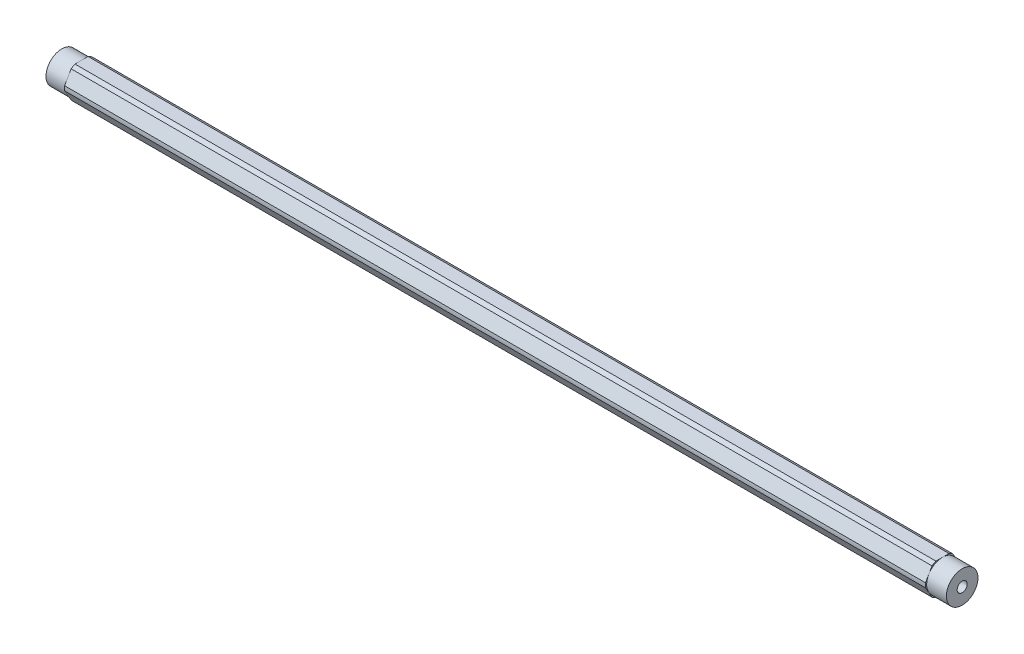
ISO-10303-21;
HEADER;
FILE_DESCRIPTION(('STEP AP214'),'2;1');
FILE_NAME('part.step','',(''),(''),'','','');
FILE_SCHEMA(('AUTOMOTIVE_DESIGN { 1 0 10303 214 1 1 1 1 }'));
ENDSEC;
DATA;
#1=APPLICATION_CONTEXT('core data for automotive mechanical design processes');
#2=APPLICATION_PROTOCOL_DEFINITION('international standard','automotive_design',2000,#1);
#3=PRODUCT_CONTEXT('',#1,'mechanical');
#4=PRODUCT('Part','Part','',(#3));
#5=PRODUCT_RELATED_PRODUCT_CATEGORY('part','',(#4));
#6=PRODUCT_DEFINITION_FORMATION('','',#4);
#7=PRODUCT_DEFINITION_CONTEXT('part definition',#1,'design');
#8=PRODUCT_DEFINITION('design','',#6,#7);
#9=PRODUCT_DEFINITION_SHAPE('','',#8);
#10=(LENGTH_UNIT() NAMED_UNIT(*) SI_UNIT(.MILLI.,.METRE.));
#11=(NAMED_UNIT(*) PLANE_ANGLE_UNIT() SI_UNIT($,.RADIAN.));
#12=(NAMED_UNIT(*) SI_UNIT($,.STERADIAN.) SOLID_ANGLE_UNIT());
#13=UNCERTAINTY_MEASURE_WITH_UNIT(LENGTH_MEASURE(1.E-05),#10,'distance_accuracy_value','');
#14=(GEOMETRIC_REPRESENTATION_CONTEXT(3) GLOBAL_UNCERTAINTY_ASSIGNED_CONTEXT((#13)) GLOBAL_UNIT_ASSIGNED_CONTEXT((#10,
#11,#12)) REPRESENTATION_CONTEXT('',''));
#15=CARTESIAN_POINT('',(0.,0.,0.));
#16=DIRECTION('',(0.,0.,1.));
#17=DIRECTION('',(1.,0.,0.));
#18=AXIS2_PLACEMENT_3D('',#15,#16,#17);
#19=CARTESIAN_POINT('',(-180.9496,0.,0.));
#20=DIRECTION('',(1.,0.,0.));
#21=DIRECTION('',(0.,0.,-1.));
#22=AXIS2_PLACEMENT_3D('',#19,#20,#21);
#23=PLANE('',#22);
#24=CARTESIAN_POINT('',(-180.9496,0.,0.));
#25=DIRECTION('',(1.,0.,0.));
#26=DIRECTION('',(0.,0.,-1.));
#27=AXIS2_PLACEMENT_3D('',#24,#25,#26);
#28=CIRCLE('',#27,2.0193);
#29=CARTESIAN_POINT('',(-180.9496,0.,-2.0193));
#30=VERTEX_POINT('',#29);
#31=EDGE_CURVE('E263',#30,#30,#28,.T.);
#32=ORIENTED_EDGE('',*,*,#31,.T.);
#33=EDGE_LOOP('',(#32));
#34=FACE_BOUND('',#33,.T.);
#35=CARTESIAN_POINT('',(-180.9496,0.,0.));
#36=DIRECTION('',(1.,0.,0.));
#37=DIRECTION('',(0.,0.,-1.));
#38=AXIS2_PLACEMENT_3D('',#35,#36,#37);
#39=CIRCLE('',#38,6.35);
#40=CARTESIAN_POINT('',(-180.9496,0.,-6.35));
#41=VERTEX_POINT('',#40);
#42=EDGE_CURVE('E73',#41,#41,#39,.F.);
#43=ORIENTED_EDGE('',*,*,#42,.T.);
#44=EDGE_LOOP('',(#43));
#45=FACE_BOUND('',#44,.T.);
#46=ADVANCED_FACE('F65',(#34,#45),#23,.F.);
#47=CARTESIAN_POINT('',(180.9496,3.175,-5.49926131403119));
#48=DIRECTION('',(0.,-0.5,0.866025403784438));
#49=DIRECTION('',(0.,-0.866025403784438,-0.5));
#50=AXIS2_PLACEMENT_3D('',#47,#48,#49);
#51=PLANE('',#50);
#52=DIRECTION('',(-1.,0.,0.));
#53=VECTOR('',#52,1.);
#54=CARTESIAN_POINT('',(180.9496,0.893039571032185,-6.81675178197583));
#55=LINE('',#54,#53);
#56=CARTESIAN_POINT('',(173.0121,0.893039571032185,-6.81675178197583));
#57=VERTEX_POINT('',#56);
#58=CARTESIAN_POINT('',(-173.0121,0.893039571032185,-6.81675178197583));
#59=VERTEX_POINT('',#58);
#60=EDGE_CURVE('E222',#57,#59,#55,.T.);
#61=ORIENTED_EDGE('',*,*,#60,.T.);
#62=DIRECTION('',(0.,0.866025403784438,0.5));
#63=VECTOR('',#62,1.);
#64=CARTESIAN_POINT('',(-173.0121,3.175,-5.49926131403119));
#65=LINE('',#64,#63);
#66=CARTESIAN_POINT('',(-173.0121,3.175,-5.49926131403119));
#67=VERTEX_POINT('',#66);
#68=EDGE_CURVE('E80',#59,#67,#65,.T.);
#69=ORIENTED_EDGE('',*,*,#68,.T.);
#70=CARTESIAN_POINT('',(-173.0121,5.45696042896782,-4.18177084608654));
#71=VERTEX_POINT('',#70);
#72=EDGE_CURVE('E191',#67,#71,#65,.T.);
#73=ORIENTED_EDGE('',*,*,#72,.T.);
#74=DIRECTION('',(-1.,0.,0.));
#75=VECTOR('',#74,1.);
#76=CARTESIAN_POINT('',(180.9496,5.45696042896782,-4.18177084608654));
#77=LINE('',#76,#75);
#78=CARTESIAN_POINT('',(173.0121,5.45696042896782,-4.18177084608654));
#79=VERTEX_POINT('',#78);
#80=EDGE_CURVE('E297',#79,#71,#77,.T.);
#81=ORIENTED_EDGE('',*,*,#80,.F.);
#82=DIRECTION('',(0.,0.866025403784438,0.5));
#83=VECTOR('',#82,1.);
#84=CARTESIAN_POINT('',(173.0121,3.175,-5.49926131403119));
#85=LINE('',#84,#83);
#86=CARTESIAN_POINT('',(173.0121,3.175,-5.49926131403119));
#87=VERTEX_POINT('',#86);
#88=EDGE_CURVE('E257',#87,#79,#85,.T.);
#89=ORIENTED_EDGE('',*,*,#88,.F.);
#90=EDGE_CURVE('E259',#57,#87,#85,.T.);
#91=ORIENTED_EDGE('',*,*,#90,.F.);
#92=EDGE_LOOP('',(#61,#69,#73,#81,#89,#91));
#93=FACE_BOUND('',#92,.T.);
#94=ADVANCED_FACE('F219',(#93),#51,.F.);
#95=CARTESIAN_POINT('',(180.9496,0.,0.));
#96=DIRECTION('',(-1.,0.,0.));
#97=DIRECTION('',(0.,0.,1.));
#98=AXIS2_PLACEMENT_3D('',#95,#96,#97);
#99=CYLINDRICAL_SURFACE('',#98,6.874999966);
#100=ORIENTED_EDGE('',*,*,#80,.T.);
#101=CARTESIAN_POINT('',(-173.0121,0.,0.));
#102=DIRECTION('',(1.,0.,0.));
#103=DIRECTION('',(0.,0.,-1.));
#104=AXIS2_PLACEMENT_3D('',#101,#102,#103);
#105=CIRCLE('',#104,6.874999966);
#106=CARTESIAN_POINT('',(-173.0121,6.35,-2.63498093588929));
#107=VERTEX_POINT('',#106);
#108=EDGE_CURVE('E197',#71,#107,#105,.T.);
#109=ORIENTED_EDGE('',*,*,#108,.T.);
#110=DIRECTION('',(-1.,0.,0.));
#111=VECTOR('',#110,1.);
#112=CARTESIAN_POINT('',(180.9496,6.35,-2.63498093588929));
#113=LINE('',#112,#111);
#114=CARTESIAN_POINT('',(173.0121,6.35,-2.63498093588929));
#115=VERTEX_POINT('',#114);
#116=EDGE_CURVE('E294',#115,#107,#113,.T.);
#117=ORIENTED_EDGE('',*,*,#116,.F.);
#118=CARTESIAN_POINT('',(173.0121,0.,0.));
#119=DIRECTION('',(1.,0.,0.));
#120=DIRECTION('',(0.,0.,-1.));
#121=AXIS2_PLACEMENT_3D('',#118,#119,#120);
#122=CIRCLE('',#121,6.874999966);
#123=EDGE_CURVE('E255',#79,#115,#122,.T.);
#124=ORIENTED_EDGE('',*,*,#123,.F.);
#125=EDGE_LOOP('',(#100,#109,#117,#124));
#126=FACE_BOUND('',#125,.T.);
#127=ADVANCED_FACE('F322',(#126),#99,.T.);
#128=CARTESIAN_POINT('',(180.9496,6.35,0.));
#129=DIRECTION('',(0.,-1.,0.));
#130=DIRECTION('',(0.,0.,-1.));
#131=AXIS2_PLACEMENT_3D('',#128,#129,#130);
#132=PLANE('',#131);
#133=ORIENTED_EDGE('',*,*,#116,.T.);
#134=DIRECTION('',(0.,0.,1.));
#135=VECTOR('',#134,1.);
#136=CARTESIAN_POINT('',(-173.0121,6.35,0.));
#137=LINE('',#136,#135);
#138=CARTESIAN_POINT('',(-173.0121,6.35,0.));
#139=VERTEX_POINT('',#138);
#140=EDGE_CURVE('E361',#107,#139,#137,.T.);
#141=ORIENTED_EDGE('',*,*,#140,.T.);
#142=CARTESIAN_POINT('',(-173.0121,6.35,2.63498093588929));
#143=VERTEX_POINT('',#142);
#144=EDGE_CURVE('E364',#139,#143,#137,.T.);
#145=ORIENTED_EDGE('',*,*,#144,.T.);
#146=DIRECTION('',(-1.,0.,0.));
#147=VECTOR('',#146,1.);
#148=CARTESIAN_POINT('',(180.9496,6.35,2.63498093588929));
#149=LINE('',#148,#147);
#150=CARTESIAN_POINT('',(173.0121,6.35,2.63498093588929));
#151=VERTEX_POINT('',#150);
#152=EDGE_CURVE('E291',#151,#143,#149,.T.);
#153=ORIENTED_EDGE('',*,*,#152,.F.);
#154=DIRECTION('',(0.,0.,1.));
#155=VECTOR('',#154,1.);
#156=CARTESIAN_POINT('',(173.0121,6.35,0.));
#157=LINE('',#156,#155);
#158=CARTESIAN_POINT('',(173.0121,6.35,0.));
#159=VERTEX_POINT('',#158);
#160=EDGE_CURVE('E252',#159,#151,#157,.T.);
#161=ORIENTED_EDGE('',*,*,#160,.F.);
#162=EDGE_CURVE('E254',#115,#159,#157,.T.);
#163=ORIENTED_EDGE('',*,*,#162,.F.);
#164=EDGE_LOOP('',(#133,#141,#145,#153,#161,#163));
#165=FACE_BOUND('',#164,.T.);
#166=ADVANCED_FACE('F329',(#165),#132,.F.);
#167=ORIENTED_EDGE('',*,*,#152,.T.);
#168=CARTESIAN_POINT('',(-173.0121,0.,0.));
#169=DIRECTION('',(1.,0.,0.));
#170=DIRECTION('',(0.,0.,-1.));
#171=AXIS2_PLACEMENT_3D('',#168,#169,#170);
#172=CIRCLE('',#171,6.874999966);
#173=CARTESIAN_POINT('',(-173.0121,5.45696042896782,4.18177084608655));
#174=VERTEX_POINT('',#173);
#175=EDGE_CURVE('E365',#143,#174,#172,.T.);
#176=ORIENTED_EDGE('',*,*,#175,.T.);
#177=DIRECTION('',(-1.,0.,0.));
#178=VECTOR('',#177,1.);
#179=CARTESIAN_POINT('',(180.9496,5.45696042896782,4.18177084608655));
#180=LINE('',#179,#178);
#181=CARTESIAN_POINT('',(173.0121,5.45696042896782,4.18177084608655));
#182=VERTEX_POINT('',#181);
#183=EDGE_CURVE('E288',#182,#174,#180,.T.);
#184=ORIENTED_EDGE('',*,*,#183,.F.);
#185=CARTESIAN_POINT('',(173.0121,0.,0.));
#186=DIRECTION('',(1.,0.,0.));
#187=DIRECTION('',(0.,0.,-1.));
#188=AXIS2_PLACEMENT_3D('',#185,#186,#187);
#189=CIRCLE('',#188,6.874999966);
#190=EDGE_CURVE('E250',#151,#182,#189,.T.);
#191=ORIENTED_EDGE('',*,*,#190,.F.);
#192=EDGE_LOOP('',(#167,#176,#184,#191));
#193=FACE_BOUND('',#192,.T.);
#194=ADVANCED_FACE('F331',(#193),#99,.T.);
#195=CARTESIAN_POINT('',(180.9496,3.175,5.49926131403119));
#196=DIRECTION('',(0.,-0.5,-0.866025403784439));
#197=DIRECTION('',(0.,0.866025403784439,-0.5));
#198=AXIS2_PLACEMENT_3D('',#195,#196,#197);
#199=PLANE('',#198);
#200=ORIENTED_EDGE('',*,*,#183,.T.);
#201=DIRECTION('',(0.,-0.866025403784439,0.5));
#202=VECTOR('',#201,1.);
#203=CARTESIAN_POINT('',(-173.0121,3.175,5.49926131403119));
#204=LINE('',#203,#202);
#205=CARTESIAN_POINT('',(-173.0121,3.175,5.49926131403119));
#206=VERTEX_POINT('',#205);
#207=EDGE_CURVE('E369',#174,#206,#204,.T.);
#208=ORIENTED_EDGE('',*,*,#207,.T.);
#209=CARTESIAN_POINT('',(-173.0121,0.893039571032186,6.81675178197583));
#210=VERTEX_POINT('',#209);
#211=EDGE_CURVE('E370',#206,#210,#204,.T.);
#212=ORIENTED_EDGE('',*,*,#211,.T.);
#213=DIRECTION('',(-1.,0.,0.));
#214=VECTOR('',#213,1.);
#215=CARTESIAN_POINT('',(180.9496,0.893039571032186,6.81675178197583));
#216=LINE('',#215,#214);
#217=CARTESIAN_POINT('',(173.0121,0.893039571032186,6.81675178197583));
#218=VERTEX_POINT('',#217);
#219=EDGE_CURVE('E285',#218,#210,#216,.T.);
#220=ORIENTED_EDGE('',*,*,#219,.F.);
#221=DIRECTION('',(0.,-0.866025403784439,0.5));
#222=VECTOR('',#221,1.);
#223=CARTESIAN_POINT('',(173.0121,3.175,5.49926131403119));
#224=LINE('',#223,#222);
#225=CARTESIAN_POINT('',(173.0121,3.175,5.49926131403119));
#226=VERTEX_POINT('',#225);
#227=EDGE_CURVE('E247',#226,#218,#224,.T.);
#228=ORIENTED_EDGE('',*,*,#227,.F.);
#229=EDGE_CURVE('E249',#182,#226,#224,.T.);
#230=ORIENTED_EDGE('',*,*,#229,.F.);
#231=EDGE_LOOP('',(#200,#208,#212,#220,#228,#230));
#232=FACE_BOUND('',#231,.T.);
#233=ADVANCED_FACE('F348',(#232),#199,.F.);
#234=ORIENTED_EDGE('',*,*,#219,.T.);
#235=CARTESIAN_POINT('',(-173.0121,0.,0.));
#236=DIRECTION('',(1.,0.,0.));
#237=DIRECTION('',(0.,0.,-1.));
#238=AXIS2_PLACEMENT_3D('',#235,#236,#237);
#239=CIRCLE('',#238,6.874999966);
#240=CARTESIAN_POINT('',(-173.0121,-0.893039571032186,6.81675178197583));
#241=VERTEX_POINT('',#240);
#242=EDGE_CURVE('E373',#210,#241,#239,.T.);
#243=ORIENTED_EDGE('',*,*,#242,.T.);
#244=DIRECTION('',(-1.,0.,0.));
#245=VECTOR('',#244,1.);
#246=CARTESIAN_POINT('',(180.9496,-0.893039571032186,6.81675178197583));
#247=LINE('',#246,#245);
#248=CARTESIAN_POINT('',(173.0121,-0.893039571032186,6.81675178197583));
#249=VERTEX_POINT('',#248);
#250=EDGE_CURVE('E282',#249,#241,#247,.T.);
#251=ORIENTED_EDGE('',*,*,#250,.F.);
#252=CARTESIAN_POINT('',(173.0121,0.,0.));
#253=DIRECTION('',(1.,0.,0.));
#254=DIRECTION('',(0.,0.,-1.));
#255=AXIS2_PLACEMENT_3D('',#252,#253,#254);
#256=CIRCLE('',#255,6.874999966);
#257=EDGE_CURVE('E245',#218,#249,#256,.T.);
#258=ORIENTED_EDGE('',*,*,#257,.F.);
#259=EDGE_LOOP('',(#234,#243,#251,#258));
#260=FACE_BOUND('',#259,.T.);
#261=ADVANCED_FACE('F346',(#260),#99,.T.);
#262=CARTESIAN_POINT('',(180.9496,-3.175,5.49926131403119));
#263=DIRECTION('',(0.,0.5,-0.866025403784439));
#264=DIRECTION('',(0.,0.866025403784439,0.5));
#265=AXIS2_PLACEMENT_3D('',#262,#263,#264);
#266=PLANE('',#265);
#267=ORIENTED_EDGE('',*,*,#250,.T.);
#268=DIRECTION('',(0.,-0.866025403784439,-0.5));
#269=VECTOR('',#268,1.);
#270=CARTESIAN_POINT('',(-173.0121,-3.175,5.49926131403119));
#271=LINE('',#270,#269);
#272=CARTESIAN_POINT('',(-173.0121,-3.175,5.49926131403119));
#273=VERTEX_POINT('',#272);
#274=EDGE_CURVE('E376',#241,#273,#271,.T.);
#275=ORIENTED_EDGE('',*,*,#274,.T.);
#276=CARTESIAN_POINT('',(-173.0121,-5.45696042896782,4.18177084608654));
#277=VERTEX_POINT('',#276);
#278=EDGE_CURVE('E377',#273,#277,#271,.T.);
#279=ORIENTED_EDGE('',*,*,#278,.T.);
#280=DIRECTION('',(-1.,0.,0.));
#281=VECTOR('',#280,1.);
#282=CARTESIAN_POINT('',(180.9496,-5.45696042896782,4.18177084608655));
#283=LINE('',#282,#281);
#284=CARTESIAN_POINT('',(173.0121,-5.45696042896782,4.18177084608654));
#285=VERTEX_POINT('',#284);
#286=EDGE_CURVE('E279',#285,#277,#283,.T.);
#287=ORIENTED_EDGE('',*,*,#286,.F.);
#288=DIRECTION('',(0.,-0.866025403784439,-0.5));
#289=VECTOR('',#288,1.);
#290=CARTESIAN_POINT('',(173.0121,-3.175,5.49926131403119));
#291=LINE('',#290,#289);
#292=CARTESIAN_POINT('',(173.0121,-3.175,5.49926131403119));
#293=VERTEX_POINT('',#292);
#294=EDGE_CURVE('E242',#293,#285,#291,.T.);
#295=ORIENTED_EDGE('',*,*,#294,.F.);
#296=EDGE_CURVE('E244',#249,#293,#291,.T.);
#297=ORIENTED_EDGE('',*,*,#296,.F.);
#298=EDGE_LOOP('',(#267,#275,#279,#287,#295,#297));
#299=FACE_BOUND('',#298,.T.);
#300=ADVANCED_FACE('F343',(#299),#266,.F.);
#301=ORIENTED_EDGE('',*,*,#286,.T.);
#302=CARTESIAN_POINT('',(-173.0121,0.,0.));
#303=DIRECTION('',(1.,0.,0.));
#304=DIRECTION('',(0.,0.,-1.));
#305=AXIS2_PLACEMENT_3D('',#302,#303,#304);
#306=CIRCLE('',#305,6.874999966);
#307=CARTESIAN_POINT('',(-173.0121,-6.35,2.63498093588928));
#308=VERTEX_POINT('',#307);
#309=EDGE_CURVE('E380',#277,#308,#306,.T.);
#310=ORIENTED_EDGE('',*,*,#309,.T.);
#311=DIRECTION('',(-1.,0.,0.));
#312=VECTOR('',#311,1.);
#313=CARTESIAN_POINT('',(180.9496,-6.35,2.63498093588928));
#314=LINE('',#313,#312);
#315=CARTESIAN_POINT('',(173.0121,-6.35,2.63498093588928));
#316=VERTEX_POINT('',#315);
#317=EDGE_CURVE('E276',#316,#308,#314,.T.);
#318=ORIENTED_EDGE('',*,*,#317,.F.);
#319=CARTESIAN_POINT('',(173.0121,0.,0.));
#320=DIRECTION('',(1.,0.,0.));
#321=DIRECTION('',(0.,0.,-1.));
#322=AXIS2_PLACEMENT_3D('',#319,#320,#321);
#323=CIRCLE('',#322,6.874999966);
#324=EDGE_CURVE('E240',#285,#316,#323,.T.);
#325=ORIENTED_EDGE('',*,*,#324,.F.);
#326=EDGE_LOOP('',(#301,#310,#318,#325));
#327=FACE_BOUND('',#326,.T.);
#328=ADVANCED_FACE('F341',(#327),#99,.T.);
#329=CARTESIAN_POINT('',(180.9496,-6.35,0.));
#330=DIRECTION('',(0.,1.,0.));
#331=DIRECTION('',(0.,0.,1.));
#332=AXIS2_PLACEMENT_3D('',#329,#330,#331);
#333=PLANE('',#332);
#334=ORIENTED_EDGE('',*,*,#317,.T.);
#335=DIRECTION('',(0.,0.,-1.));
#336=VECTOR('',#335,1.);
#337=CARTESIAN_POINT('',(-173.0121,-6.35,0.));
#338=LINE('',#337,#336);
#339=CARTESIAN_POINT('',(-173.0121,-6.35,0.));
#340=VERTEX_POINT('',#339);
#341=EDGE_CURVE('E383',#308,#340,#338,.T.);
#342=ORIENTED_EDGE('',*,*,#341,.T.);
#343=CARTESIAN_POINT('',(-173.0121,-6.35,-2.63498093588928));
#344=VERTEX_POINT('',#343);
#345=EDGE_CURVE('E384',#340,#344,#338,.T.);
#346=ORIENTED_EDGE('',*,*,#345,.T.);
#347=DIRECTION('',(-1.,0.,0.));
#348=VECTOR('',#347,1.);
#349=CARTESIAN_POINT('',(180.9496,-6.35,-2.63498093588928));
#350=LINE('',#349,#348);
#351=CARTESIAN_POINT('',(173.0121,-6.35,-2.63498093588928));
#352=VERTEX_POINT('',#351);
#353=EDGE_CURVE('E273',#352,#344,#350,.T.);
#354=ORIENTED_EDGE('',*,*,#353,.F.);
#355=DIRECTION('',(0.,0.,-1.));
#356=VECTOR('',#355,1.);
#357=CARTESIAN_POINT('',(173.0121,-6.35,0.));
#358=LINE('',#357,#356);
#359=CARTESIAN_POINT('',(173.0121,-6.35,0.));
#360=VERTEX_POINT('',#359);
#361=EDGE_CURVE('E237',#360,#352,#358,.T.);
#362=ORIENTED_EDGE('',*,*,#361,.F.);
#363=EDGE_CURVE('E239',#316,#360,#358,.T.);
#364=ORIENTED_EDGE('',*,*,#363,.F.);
#365=EDGE_LOOP('',(#334,#342,#346,#354,#362,#364));
#366=FACE_BOUND('',#365,.T.);
#367=ADVANCED_FACE('F338',(#366),#333,.F.);
#368=ORIENTED_EDGE('',*,*,#353,.T.);
#369=CARTESIAN_POINT('',(-173.0121,0.,0.));
#370=DIRECTION('',(1.,0.,0.));
#371=DIRECTION('',(0.,0.,-1.));
#372=AXIS2_PLACEMENT_3D('',#369,#370,#371);
#373=CIRCLE('',#372,6.874999966);
#374=CARTESIAN_POINT('',(-173.0121,-5.45696042896782,-4.18177084608655));
#375=VERTEX_POINT('',#374);
#376=EDGE_CURVE('E387',#344,#375,#373,.T.);
#377=ORIENTED_EDGE('',*,*,#376,.T.);
#378=DIRECTION('',(-1.,0.,0.));
#379=VECTOR('',#378,1.);
#380=CARTESIAN_POINT('',(180.9496,-5.45696042896782,-4.18177084608655));
#381=LINE('',#380,#379);
#382=CARTESIAN_POINT('',(173.0121,-5.45696042896782,-4.18177084608655));
#383=VERTEX_POINT('',#382);
#384=EDGE_CURVE('E270',#383,#375,#381,.T.);
#385=ORIENTED_EDGE('',*,*,#384,.F.);
#386=CARTESIAN_POINT('',(173.0121,0.,0.));
#387=DIRECTION('',(1.,0.,0.));
#388=DIRECTION('',(0.,0.,-1.));
#389=AXIS2_PLACEMENT_3D('',#386,#387,#388);
#390=CIRCLE('',#389,6.874999966);
#391=EDGE_CURVE('E235',#352,#383,#390,.T.);
#392=ORIENTED_EDGE('',*,*,#391,.F.);
#393=EDGE_LOOP('',(#368,#377,#385,#392));
#394=FACE_BOUND('',#393,.T.);
#395=ADVANCED_FACE('F336',(#394),#99,.T.);
#396=CARTESIAN_POINT('',(180.9496,-3.175,-5.49926131403119));
#397=DIRECTION('',(0.,0.5,0.866025403784439));
#398=DIRECTION('',(0.,-0.866025403784439,0.5));
#399=AXIS2_PLACEMENT_3D('',#396,#397,#398);
#400=PLANE('',#399);
#401=ORIENTED_EDGE('',*,*,#384,.T.);
#402=DIRECTION('',(0.,0.866025403784439,-0.5));
#403=VECTOR('',#402,1.);
#404=CARTESIAN_POINT('',(-173.0121,-3.175,-5.49926131403119));
#405=LINE('',#404,#403);
#406=CARTESIAN_POINT('',(-173.0121,-3.175,-5.49926131403119));
#407=VERTEX_POINT('',#406);
#408=EDGE_CURVE('E390',#375,#407,#405,.T.);
#409=ORIENTED_EDGE('',*,*,#408,.T.);
#410=CARTESIAN_POINT('',(-173.0121,-0.893039571032186,-6.81675178197583));
#411=VERTEX_POINT('',#410);
#412=EDGE_CURVE('E206',#407,#411,#405,.T.);
#413=ORIENTED_EDGE('',*,*,#412,.T.);
#414=DIRECTION('',(-1.,0.,0.));
#415=VECTOR('',#414,1.);
#416=CARTESIAN_POINT('',(180.9496,-0.893039571032186,-6.81675178197583));
#417=LINE('',#416,#415);
#418=CARTESIAN_POINT('',(173.0121,-0.893039571032186,-6.81675178197583));
#419=VERTEX_POINT('',#418);
#420=EDGE_CURVE('E267',#419,#411,#417,.T.);
#421=ORIENTED_EDGE('',*,*,#420,.F.);
#422=DIRECTION('',(0.,0.866025403784439,-0.5));
#423=VECTOR('',#422,1.);
#424=CARTESIAN_POINT('',(173.0121,-3.175,-5.49926131403119));
#425=LINE('',#424,#423);
#426=CARTESIAN_POINT('',(173.0121,-3.175,-5.49926131403119));
#427=VERTEX_POINT('',#426);
#428=EDGE_CURVE('E87',#427,#419,#425,.T.);
#429=ORIENTED_EDGE('',*,*,#428,.F.);
#430=EDGE_CURVE('E234',#383,#427,#425,.T.);
#431=ORIENTED_EDGE('',*,*,#430,.F.);
#432=EDGE_LOOP('',(#401,#409,#413,#421,#429,#431));
#433=FACE_BOUND('',#432,.T.);
#434=ADVANCED_FACE('F333',(#433),#400,.F.);
#435=ORIENTED_EDGE('',*,*,#420,.T.);
#436=CARTESIAN_POINT('',(-173.0121,0.,0.));
#437=DIRECTION('',(1.,0.,0.));
#438=DIRECTION('',(0.,0.,-1.));
#439=AXIS2_PLACEMENT_3D('',#436,#437,#438);
#440=CIRCLE('',#439,6.874999966);
#441=EDGE_CURVE('E12',#411,#59,#440,.T.);
#442=ORIENTED_EDGE('',*,*,#441,.T.);
#443=ORIENTED_EDGE('',*,*,#60,.F.);
#444=CARTESIAN_POINT('',(173.0121,0.,0.));
#445=DIRECTION('',(1.,0.,0.));
#446=DIRECTION('',(0.,0.,-1.));
#447=AXIS2_PLACEMENT_3D('',#444,#445,#446);
#448=CIRCLE('',#447,6.874999966);
#449=EDGE_CURVE('E302',#419,#57,#448,.T.);
#450=ORIENTED_EDGE('',*,*,#449,.F.);
#451=EDGE_LOOP('',(#435,#442,#443,#450));
#452=FACE_BOUND('',#451,.T.);
#453=ADVANCED_FACE('F332',(#452),#99,.T.);
#454=CARTESIAN_POINT('',(180.9496,0.,0.));
#455=DIRECTION('',(1.,0.,0.));
#456=DIRECTION('',(0.,0.,-1.));
#457=AXIS2_PLACEMENT_3D('',#454,#455,#456);
#458=PLANE('',#457);
#459=CARTESIAN_POINT('',(180.9496,0.,0.));
#460=DIRECTION('',(1.,0.,0.));
#461=DIRECTION('',(0.,0.,-1.));
#462=AXIS2_PLACEMENT_3D('',#459,#460,#461);
#463=CIRCLE('',#462,2.0193);
#464=CARTESIAN_POINT('',(180.9496,0.,-2.0193));
#465=VERTEX_POINT('',#464);
#466=EDGE_CURVE('E260',#465,#465,#463,.T.);
#467=ORIENTED_EDGE('',*,*,#466,.F.);
#468=EDGE_LOOP('',(#467));
#469=FACE_BOUND('',#468,.T.);
#470=CARTESIAN_POINT('',(180.9496,0.,0.));
#471=DIRECTION('',(1.,0.,0.));
#472=DIRECTION('',(0.,0.,-1.));
#473=AXIS2_PLACEMENT_3D('',#470,#471,#472);
#474=CIRCLE('',#473,6.35);
#475=CARTESIAN_POINT('',(180.9496,0.,-6.35));
#476=VERTEX_POINT('',#475);
#477=EDGE_CURVE('E299',#476,#476,#474,.T.);
#478=ORIENTED_EDGE('',*,*,#477,.T.);
#479=EDGE_LOOP('',(#478));
#480=FACE_BOUND('',#479,.T.);
#481=ADVANCED_FACE('F325',(#469,#480),#458,.T.);
#482=CARTESIAN_POINT('',(180.9496,0.,0.));
#483=DIRECTION('',(-1.,0.,0.));
#484=DIRECTION('',(0.,0.,1.));
#485=AXIS2_PLACEMENT_3D('',#482,#483,#484);
#486=CYLINDRICAL_SURFACE('',#485,2.0193);
#487=ORIENTED_EDGE('',*,*,#466,.T.);
#488=EDGE_LOOP('',(#487));
#489=FACE_BOUND('',#488,.T.);
#490=ORIENTED_EDGE('',*,*,#31,.F.);
#491=EDGE_LOOP('',(#490));
#492=FACE_BOUND('',#491,.T.);
#493=ADVANCED_FACE('F67',(#489,#492),#486,.F.);
#494=CARTESIAN_POINT('',(173.0121,0.,0.));
#495=DIRECTION('',(1.,0.,0.));
#496=DIRECTION('',(0.,0.,-1.));
#497=AXIS2_PLACEMENT_3D('',#494,#495,#496);
#498=PLANE('',#497);
#499=ORIENTED_EDGE('',*,*,#90,.T.);
#500=CARTESIAN_POINT('',(173.0121,0.,0.));
#501=DIRECTION('',(1.,0.,0.));
#502=DIRECTION('',(0.,0.,-1.));
#503=AXIS2_PLACEMENT_3D('',#500,#501,#502);
#504=CIRCLE('',#503,6.35);
#505=EDGE_CURVE('E223',#427,#87,#504,.T.);
#506=ORIENTED_EDGE('',*,*,#505,.F.);
#507=ORIENTED_EDGE('',*,*,#428,.T.);
#508=ORIENTED_EDGE('',*,*,#449,.T.);
#509=EDGE_LOOP('',(#499,#506,#507,#508));
#510=FACE_BOUND('',#509,.T.);
#511=ADVANCED_FACE('F437',(#510),#498,.T.);
#512=ORIENTED_EDGE('',*,*,#88,.T.);
#513=ORIENTED_EDGE('',*,*,#123,.T.);
#514=ORIENTED_EDGE('',*,*,#162,.T.);
#515=EDGE_CURVE('E227',#87,#159,#504,.T.);
#516=ORIENTED_EDGE('',*,*,#515,.F.);
#517=EDGE_LOOP('',(#512,#513,#514,#516));
#518=FACE_BOUND('',#517,.T.);
#519=ADVANCED_FACE('F431',(#518),#498,.T.);
#520=ORIENTED_EDGE('',*,*,#160,.T.);
#521=ORIENTED_EDGE('',*,*,#190,.T.);
#522=ORIENTED_EDGE('',*,*,#229,.T.);
#523=EDGE_CURVE('E232',#159,#226,#504,.T.);
#524=ORIENTED_EDGE('',*,*,#523,.F.);
#525=EDGE_LOOP('',(#520,#521,#522,#524));
#526=FACE_BOUND('',#525,.T.);
#527=ADVANCED_FACE('F420',(#526),#498,.T.);
#528=ORIENTED_EDGE('',*,*,#227,.T.);
#529=ORIENTED_EDGE('',*,*,#257,.T.);
#530=ORIENTED_EDGE('',*,*,#296,.T.);
#531=EDGE_CURVE('E425',#226,#293,#504,.T.);
#532=ORIENTED_EDGE('',*,*,#531,.F.);
#533=EDGE_LOOP('',(#528,#529,#530,#532));
#534=FACE_BOUND('',#533,.T.);
#535=ADVANCED_FACE('F453',(#534),#498,.T.);
#536=ORIENTED_EDGE('',*,*,#294,.T.);
#537=ORIENTED_EDGE('',*,*,#324,.T.);
#538=ORIENTED_EDGE('',*,*,#363,.T.);
#539=EDGE_CURVE('E439',#293,#360,#504,.T.);
#540=ORIENTED_EDGE('',*,*,#539,.F.);
#541=EDGE_LOOP('',(#536,#537,#538,#540));
#542=FACE_BOUND('',#541,.T.);
#543=ADVANCED_FACE('F447',(#542),#498,.T.);
#544=ORIENTED_EDGE('',*,*,#361,.T.);
#545=ORIENTED_EDGE('',*,*,#391,.T.);
#546=ORIENTED_EDGE('',*,*,#430,.T.);
#547=EDGE_CURVE('E225',#360,#427,#504,.T.);
#548=ORIENTED_EDGE('',*,*,#547,.F.);
#549=EDGE_LOOP('',(#544,#545,#546,#548));
#550=FACE_BOUND('',#549,.T.);
#551=ADVANCED_FACE('F435',(#550),#498,.T.);
#552=CARTESIAN_POINT('',(173.0121,0.,0.));
#553=DIRECTION('',(1.,0.,0.));
#554=DIRECTION('',(0.,0.,-1.));
#555=AXIS2_PLACEMENT_3D('',#552,#553,#554);
#556=CYLINDRICAL_SURFACE('',#555,6.35);
#557=ORIENTED_EDGE('',*,*,#477,.F.);
#558=EDGE_LOOP('',(#557));
#559=FACE_BOUND('',#558,.T.);
#560=ORIENTED_EDGE('',*,*,#505,.T.);
#561=ORIENTED_EDGE('',*,*,#515,.T.);
#562=ORIENTED_EDGE('',*,*,#523,.T.);
#563=ORIENTED_EDGE('',*,*,#531,.T.);
#564=ORIENTED_EDGE('',*,*,#539,.T.);
#565=ORIENTED_EDGE('',*,*,#547,.T.);
#566=EDGE_LOOP('',(#560,#561,#562,#563,#564,#565));
#567=FACE_BOUND('',#566,.T.);
#568=ADVANCED_FACE('F427',(#559,#567),#556,.T.);
#569=CARTESIAN_POINT('',(-173.0121,0.,0.));
#570=DIRECTION('',(1.,0.,0.));
#571=DIRECTION('',(0.,0.,-1.));
#572=AXIS2_PLACEMENT_3D('',#569,#570,#571);
#573=PLANE('',#572);
#574=ORIENTED_EDGE('',*,*,#441,.F.);
#575=ORIENTED_EDGE('',*,*,#412,.F.);
#576=CARTESIAN_POINT('',(-173.0121,0.,0.));
#577=DIRECTION('',(1.,0.,0.));
#578=DIRECTION('',(0.,0.,-1.));
#579=AXIS2_PLACEMENT_3D('',#576,#577,#578);
#580=CIRCLE('',#579,6.35);
#581=EDGE_CURVE('E203',#407,#67,#580,.T.);
#582=ORIENTED_EDGE('',*,*,#581,.T.);
#583=ORIENTED_EDGE('',*,*,#68,.F.);
#584=EDGE_LOOP('',(#574,#575,#582,#583));
#585=FACE_BOUND('',#584,.T.);
#586=ADVANCED_FACE('F204',(#585),#573,.F.);
#587=EDGE_CURVE('E194',#67,#139,#580,.T.);
#588=ORIENTED_EDGE('',*,*,#587,.T.);
#589=ORIENTED_EDGE('',*,*,#140,.F.);
#590=ORIENTED_EDGE('',*,*,#108,.F.);
#591=ORIENTED_EDGE('',*,*,#72,.F.);
#592=EDGE_LOOP('',(#588,#589,#590,#591));
#593=FACE_BOUND('',#592,.T.);
#594=ADVANCED_FACE('F192',(#593),#573,.F.);
#595=EDGE_CURVE('E217',#139,#206,#580,.T.);
#596=ORIENTED_EDGE('',*,*,#595,.T.);
#597=ORIENTED_EDGE('',*,*,#207,.F.);
#598=ORIENTED_EDGE('',*,*,#175,.F.);
#599=ORIENTED_EDGE('',*,*,#144,.F.);
#600=EDGE_LOOP('',(#596,#597,#598,#599));
#601=FACE_BOUND('',#600,.T.);
#602=ADVANCED_FACE('F411',(#601),#573,.F.);
#603=EDGE_CURVE('E406',#206,#273,#580,.T.);
#604=ORIENTED_EDGE('',*,*,#603,.T.);
#605=ORIENTED_EDGE('',*,*,#274,.F.);
#606=ORIENTED_EDGE('',*,*,#242,.F.);
#607=ORIENTED_EDGE('',*,*,#211,.F.);
#608=EDGE_LOOP('',(#604,#605,#606,#607));
#609=FACE_BOUND('',#608,.T.);
#610=ADVANCED_FACE('F450',(#609),#573,.F.);
#611=EDGE_CURVE('E403',#273,#340,#580,.T.);
#612=ORIENTED_EDGE('',*,*,#611,.T.);
#613=ORIENTED_EDGE('',*,*,#341,.F.);
#614=ORIENTED_EDGE('',*,*,#309,.F.);
#615=ORIENTED_EDGE('',*,*,#278,.F.);
#616=EDGE_LOOP('',(#612,#613,#614,#615));
#617=FACE_BOUND('',#616,.T.);
#618=ADVANCED_FACE('F312',(#617),#573,.F.);
#619=EDGE_CURVE('E210',#340,#407,#580,.T.);
#620=ORIENTED_EDGE('',*,*,#619,.T.);
#621=ORIENTED_EDGE('',*,*,#408,.F.);
#622=ORIENTED_EDGE('',*,*,#376,.F.);
#623=ORIENTED_EDGE('',*,*,#345,.F.);
#624=EDGE_LOOP('',(#620,#621,#622,#623));
#625=FACE_BOUND('',#624,.T.);
#626=ADVANCED_FACE('F307',(#625),#573,.F.);
#627=CARTESIAN_POINT('',(-173.0121,0.,0.));
#628=DIRECTION('',(-1.,0.,0.));
#629=DIRECTION('',(0.,0.,1.));
#630=AXIS2_PLACEMENT_3D('',#627,#628,#629);
#631=CYLINDRICAL_SURFACE('',#630,6.35);
#632=ORIENTED_EDGE('',*,*,#587,.F.);
#633=ORIENTED_EDGE('',*,*,#581,.F.);
#634=ORIENTED_EDGE('',*,*,#619,.F.);
#635=ORIENTED_EDGE('',*,*,#611,.F.);
#636=ORIENTED_EDGE('',*,*,#603,.F.);
#637=ORIENTED_EDGE('',*,*,#595,.F.);
#638=EDGE_LOOP('',(#632,#633,#634,#635,#636,#637));
#639=FACE_BOUND('',#638,.T.);
#640=ORIENTED_EDGE('',*,*,#42,.F.);
#641=EDGE_LOOP('',(#640));
#642=FACE_BOUND('',#641,.T.);
#643=ADVANCED_FACE('F213',(#639,#642),#631,.T.);
#644=CLOSED_SHELL('',(#46,#94,#127,#166,#194,#233,#261,#300,#328,#367,#395,#434,#453,#481,#493,
#511,#519,#527,#535,#543,#551,#568,#586,#594,#602,#610,#618,#626,#643));
#645=MANIFOLD_SOLID_BREP('B2',#644);
#646=ADVANCED_BREP_SHAPE_REPRESENTATION('',(#18,#645),#14);
#647=SHAPE_DEFINITION_REPRESENTATION(#9,#646);
ENDSEC;
END-ISO-10303-21;
